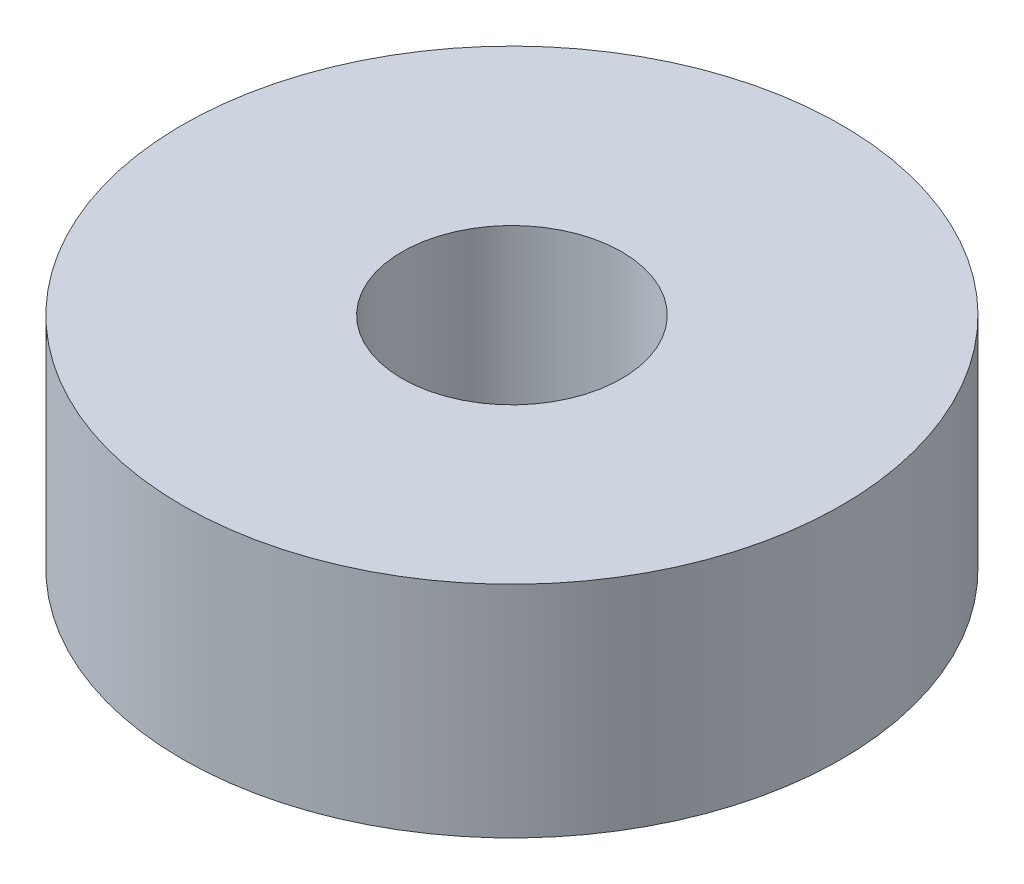
ISO-10303-21;
HEADER;
FILE_DESCRIPTION(('STEP AP214'),'2;1');
FILE_NAME('part.step','',(''),(''),'','','');
FILE_SCHEMA(('AUTOMOTIVE_DESIGN { 1 0 10303 214 1 1 1 1 }'));
ENDSEC;
DATA;
#1=APPLICATION_CONTEXT('core data for automotive mechanical design processes');
#2=APPLICATION_PROTOCOL_DEFINITION('international standard','automotive_design',2000,#1);
#3=PRODUCT_CONTEXT('',#1,'mechanical');
#4=PRODUCT('Part','Part','',(#3));
#5=PRODUCT_RELATED_PRODUCT_CATEGORY('part','',(#4));
#6=PRODUCT_DEFINITION_FORMATION('','',#4);
#7=PRODUCT_DEFINITION_CONTEXT('part definition',#1,'design');
#8=PRODUCT_DEFINITION('design','',#6,#7);
#9=PRODUCT_DEFINITION_SHAPE('','',#8);
#10=(LENGTH_UNIT() NAMED_UNIT(*) SI_UNIT(.MILLI.,.METRE.));
#11=(NAMED_UNIT(*) PLANE_ANGLE_UNIT() SI_UNIT($,.RADIAN.));
#12=(NAMED_UNIT(*) SI_UNIT($,.STERADIAN.) SOLID_ANGLE_UNIT());
#13=UNCERTAINTY_MEASURE_WITH_UNIT(LENGTH_MEASURE(1.E-05),#10,'distance_accuracy_value','');
#14=(GEOMETRIC_REPRESENTATION_CONTEXT(3) GLOBAL_UNCERTAINTY_ASSIGNED_CONTEXT((#13)) GLOBAL_UNIT_ASSIGNED_CONTEXT((#10,
#11,#12)) REPRESENTATION_CONTEXT('',''));
#15=CARTESIAN_POINT('',(0.,0.,0.));
#16=DIRECTION('',(0.,0.,1.));
#17=DIRECTION('',(1.,0.,0.));
#18=AXIS2_PLACEMENT_3D('',#15,#16,#17);
#19=CARTESIAN_POINT('',(0.,6.35,0.));
#20=DIRECTION('',(0.,1.,0.));
#21=DIRECTION('',(0.,0.,1.));
#22=AXIS2_PLACEMENT_3D('',#19,#20,#21);
#23=PLANE('',#22);
#24=CARTESIAN_POINT('',(0.,6.35,0.));
#25=DIRECTION('',(0.,1.,0.));
#26=DIRECTION('',(0.,0.,1.));
#27=AXIS2_PLACEMENT_3D('',#24,#25,#26);
#28=CIRCLE('',#27,9.525);
#29=CARTESIAN_POINT('',(0.,6.35,9.525));
#30=VERTEX_POINT('',#29);
#31=EDGE_CURVE('E10',#30,#30,#28,.T.);
#32=ORIENTED_EDGE('',*,*,#31,.T.);
#33=EDGE_LOOP('',(#32));
#34=FACE_BOUND('',#33,.T.);
#35=CARTESIAN_POINT('',(0.,6.35,0.));
#36=DIRECTION('',(0.,1.,0.));
#37=DIRECTION('',(0.,0.,1.));
#38=AXIS2_PLACEMENT_3D('',#35,#36,#37);
#39=CIRCLE('',#38,3.175);
#40=CARTESIAN_POINT('',(0.,6.35,3.175));
#41=VERTEX_POINT('',#40);
#42=EDGE_CURVE('E50',#41,#41,#39,.T.);
#43=ORIENTED_EDGE('',*,*,#42,.F.);
#44=EDGE_LOOP('',(#43));
#45=FACE_BOUND('',#44,.T.);
#46=ADVANCED_FACE('F37',(#34,#45),#23,.T.);
#47=CARTESIAN_POINT('',(0.,0.,0.));
#48=DIRECTION('',(0.,1.,0.));
#49=DIRECTION('',(0.,0.,1.));
#50=AXIS2_PLACEMENT_3D('',#47,#48,#49);
#51=PLANE('',#50);
#52=CARTESIAN_POINT('',(0.,0.,0.));
#53=DIRECTION('',(0.,1.,0.));
#54=DIRECTION('',(0.,0.,1.));
#55=AXIS2_PLACEMENT_3D('',#52,#53,#54);
#56=CIRCLE('',#55,9.525);
#57=CARTESIAN_POINT('',(0.,0.,9.525));
#58=VERTEX_POINT('',#57);
#59=EDGE_CURVE('E41',#58,#58,#56,.T.);
#60=ORIENTED_EDGE('',*,*,#59,.F.);
#61=EDGE_LOOP('',(#60));
#62=FACE_BOUND('',#61,.T.);
#63=CARTESIAN_POINT('',(0.,0.,0.));
#64=DIRECTION('',(0.,1.,0.));
#65=DIRECTION('',(0.,0.,1.));
#66=AXIS2_PLACEMENT_3D('',#63,#64,#65);
#67=CIRCLE('',#66,3.175);
#68=CARTESIAN_POINT('',(0.,0.,3.175));
#69=VERTEX_POINT('',#68);
#70=EDGE_CURVE('E52',#69,#69,#67,.T.);
#71=ORIENTED_EDGE('',*,*,#70,.T.);
#72=EDGE_LOOP('',(#71));
#73=FACE_BOUND('',#72,.T.);
#74=ADVANCED_FACE('F64',(#62,#73),#51,.F.);
#75=CARTESIAN_POINT('',(0.,6.35,0.));
#76=DIRECTION('',(0.,-1.,0.));
#77=DIRECTION('',(0.,0.,-1.));
#78=AXIS2_PLACEMENT_3D('',#75,#76,#77);
#79=CYLINDRICAL_SURFACE('',#78,9.525);
#80=ORIENTED_EDGE('',*,*,#31,.F.);
#81=EDGE_LOOP('',(#80));
#82=FACE_BOUND('',#81,.T.);
#83=ORIENTED_EDGE('',*,*,#59,.T.);
#84=EDGE_LOOP('',(#83));
#85=FACE_BOUND('',#84,.T.);
#86=ADVANCED_FACE('F39',(#82,#85),#79,.T.);
#87=CARTESIAN_POINT('',(0.,6.35,0.));
#88=DIRECTION('',(0.,-1.,0.));
#89=DIRECTION('',(0.,0.,-1.));
#90=AXIS2_PLACEMENT_3D('',#87,#88,#89);
#91=CYLINDRICAL_SURFACE('',#90,3.175);
#92=ORIENTED_EDGE('',*,*,#42,.T.);
#93=EDGE_LOOP('',(#92));
#94=FACE_BOUND('',#93,.T.);
#95=ORIENTED_EDGE('',*,*,#70,.F.);
#96=EDGE_LOOP('',(#95));
#97=FACE_BOUND('',#96,.T.);
#98=ADVANCED_FACE('F60',(#94,#97),#91,.F.);
#99=CLOSED_SHELL('',(#46,#74,#86,#98));
#100=MANIFOLD_SOLID_BREP('B2',#99);
#101=ADVANCED_BREP_SHAPE_REPRESENTATION('',(#18,#100),#14);
#102=SHAPE_DEFINITION_REPRESENTATION(#9,#101);
ENDSEC;
END-ISO-10303-21;
